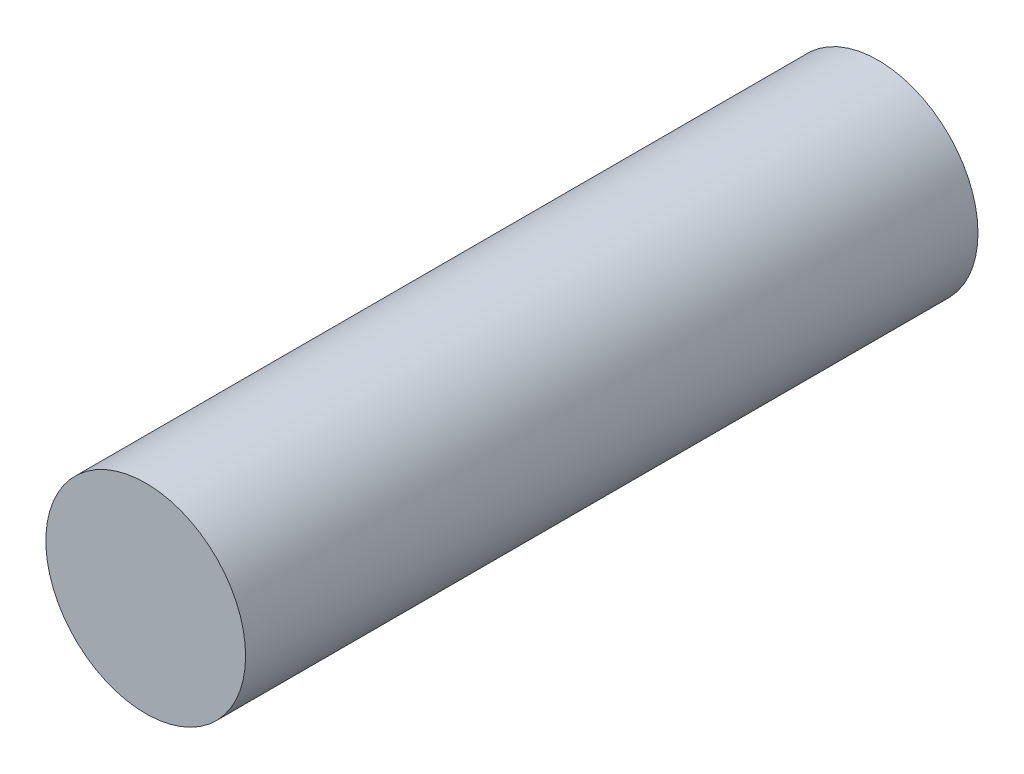
ISO-10303-21;
HEADER;
FILE_DESCRIPTION(('STEP AP214'),'2;1');
FILE_NAME('part.step','',(''),(''),'','','');
FILE_SCHEMA(('AUTOMOTIVE_DESIGN { 1 0 10303 214 1 1 1 1 }'));
ENDSEC;
DATA;
#1=APPLICATION_CONTEXT('core data for automotive mechanical design processes');
#2=APPLICATION_PROTOCOL_DEFINITION('international standard','automotive_design',2000,#1);
#3=PRODUCT_CONTEXT('',#1,'mechanical');
#4=PRODUCT('Part','Part','',(#3));
#5=PRODUCT_RELATED_PRODUCT_CATEGORY('part','',(#4));
#6=PRODUCT_DEFINITION_FORMATION('','',#4);
#7=PRODUCT_DEFINITION_CONTEXT('part definition',#1,'design');
#8=PRODUCT_DEFINITION('design','',#6,#7);
#9=PRODUCT_DEFINITION_SHAPE('','',#8);
#10=(LENGTH_UNIT() NAMED_UNIT(*) SI_UNIT(.MILLI.,.METRE.));
#11=(NAMED_UNIT(*) PLANE_ANGLE_UNIT() SI_UNIT($,.RADIAN.));
#12=(NAMED_UNIT(*) SI_UNIT($,.STERADIAN.) SOLID_ANGLE_UNIT());
#13=UNCERTAINTY_MEASURE_WITH_UNIT(LENGTH_MEASURE(1.E-05),#10,'distance_accuracy_value','');
#14=(GEOMETRIC_REPRESENTATION_CONTEXT(3) GLOBAL_UNCERTAINTY_ASSIGNED_CONTEXT((#13)) GLOBAL_UNIT_ASSIGNED_CONTEXT((#10,
#11,#12)) REPRESENTATION_CONTEXT('',''));
#15=CARTESIAN_POINT('',(0.,0.,0.));
#16=DIRECTION('',(0.,0.,1.));
#17=DIRECTION('',(1.,0.,0.));
#18=AXIS2_PLACEMENT_3D('',#15,#16,#17);
#19=CARTESIAN_POINT('',(0.,0.,22.));
#20=DIRECTION('',(0.,0.,-1.));
#21=DIRECTION('',(-1.,0.,0.));
#22=AXIS2_PLACEMENT_3D('',#19,#20,#21);
#23=CYLINDRICAL_SURFACE('',#22,6.);
#24=CARTESIAN_POINT('',(0.,0.,22.));
#25=DIRECTION('',(0.,0.,1.));
#26=DIRECTION('',(1.,0.,0.));
#27=AXIS2_PLACEMENT_3D('',#24,#25,#26);
#28=CIRCLE('',#27,6.);
#29=CARTESIAN_POINT('',(6.,0.,22.));
#30=VERTEX_POINT('',#29);
#31=EDGE_CURVE('E10',#30,#30,#28,.T.);
#32=ORIENTED_EDGE('',*,*,#31,.F.);
#33=EDGE_LOOP('',(#32));
#34=FACE_BOUND('',#33,.T.);
#35=CARTESIAN_POINT('',(0.,0.,-22.));
#36=DIRECTION('',(0.,0.,1.));
#37=DIRECTION('',(1.,0.,0.));
#38=AXIS2_PLACEMENT_3D('',#35,#36,#37);
#39=CIRCLE('',#38,6.);
#40=CARTESIAN_POINT('',(6.,0.,-22.));
#41=VERTEX_POINT('',#40);
#42=EDGE_CURVE('E45',#41,#41,#39,.T.);
#43=ORIENTED_EDGE('',*,*,#42,.T.);
#44=EDGE_LOOP('',(#43));
#45=FACE_BOUND('',#44,.T.);
#46=ADVANCED_FACE('F39',(#34,#45),#23,.T.);
#47=CARTESIAN_POINT('',(0.,0.,22.));
#48=DIRECTION('',(0.,0.,1.));
#49=DIRECTION('',(1.,0.,0.));
#50=AXIS2_PLACEMENT_3D('',#47,#48,#49);
#51=PLANE('',#50);
#52=ORIENTED_EDGE('',*,*,#31,.T.);
#53=EDGE_LOOP('',(#52));
#54=FACE_BOUND('',#53,.T.);
#55=ADVANCED_FACE('F53',(#54),#51,.T.);
#56=CARTESIAN_POINT('',(0.,0.,-22.));
#57=DIRECTION('',(0.,0.,1.));
#58=DIRECTION('',(1.,0.,0.));
#59=AXIS2_PLACEMENT_3D('',#56,#57,#58);
#60=PLANE('',#59);
#61=ORIENTED_EDGE('',*,*,#42,.F.);
#62=EDGE_LOOP('',(#61));
#63=FACE_BOUND('',#62,.T.);
#64=ADVANCED_FACE('F55',(#63),#60,.F.);
#65=CLOSED_SHELL('',(#46,#55,#64));
#66=MANIFOLD_SOLID_BREP('B2',#65);
#67=ADVANCED_BREP_SHAPE_REPRESENTATION('',(#18,#66),#14);
#68=SHAPE_DEFINITION_REPRESENTATION(#9,#67);
ENDSEC;
END-ISO-10303-21;
